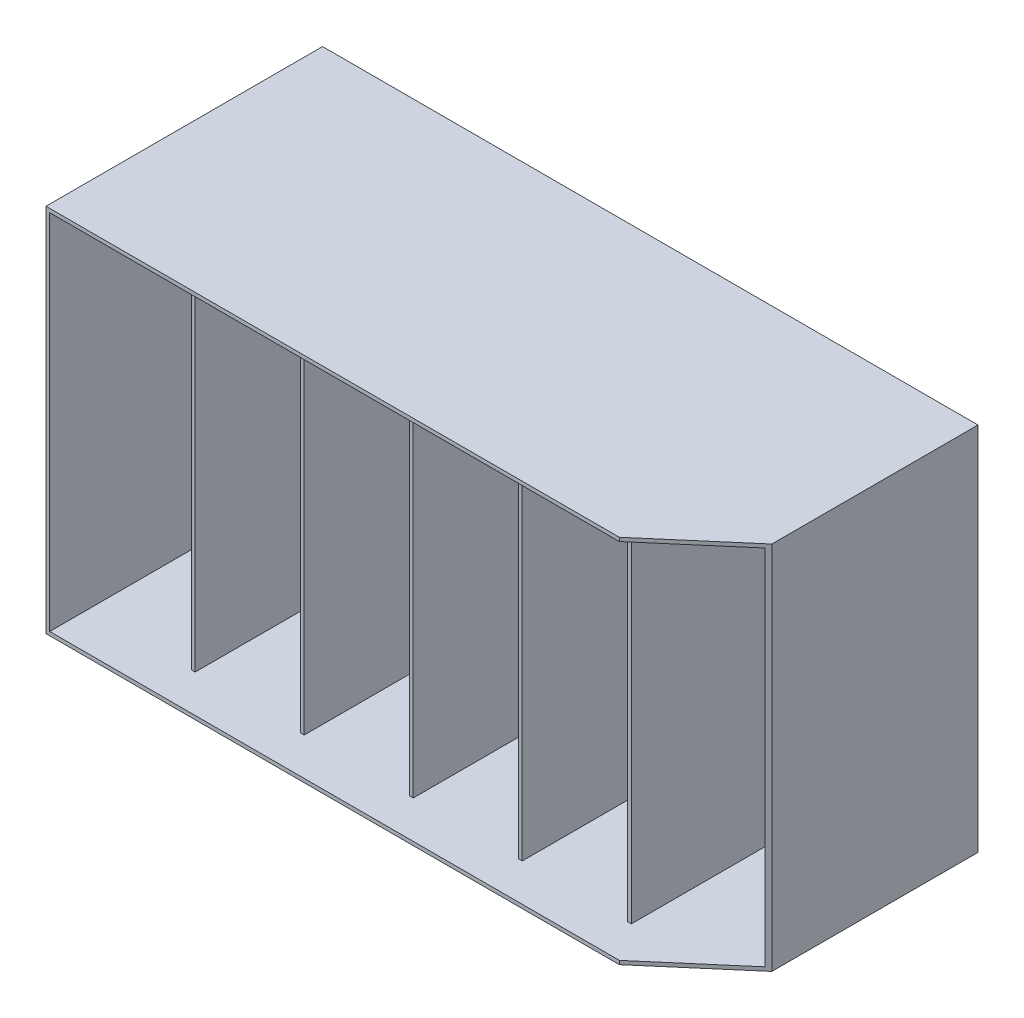
ISO-10303-21;
HEADER;
FILE_DESCRIPTION(('STEP AP214'),'2;1');
FILE_NAME('part.step','',(''),(''),'','','');
FILE_SCHEMA(('AUTOMOTIVE_DESIGN { 1 0 10303 214 1 1 1 1 }'));
ENDSEC;
DATA;
#1=APPLICATION_CONTEXT('core data for automotive mechanical design processes');
#2=APPLICATION_PROTOCOL_DEFINITION('international standard','automotive_design',2000,#1);
#3=PRODUCT_CONTEXT('',#1,'mechanical');
#4=PRODUCT('Part','Part','',(#3));
#5=PRODUCT_RELATED_PRODUCT_CATEGORY('part','',(#4));
#6=PRODUCT_DEFINITION_FORMATION('','',#4);
#7=PRODUCT_DEFINITION_CONTEXT('part definition',#1,'design');
#8=PRODUCT_DEFINITION('design','',#6,#7);
#9=PRODUCT_DEFINITION_SHAPE('','',#8);
#10=(LENGTH_UNIT() NAMED_UNIT(*) SI_UNIT(.MILLI.,.METRE.));
#11=(NAMED_UNIT(*) PLANE_ANGLE_UNIT() SI_UNIT($,.RADIAN.));
#12=(NAMED_UNIT(*) SI_UNIT($,.STERADIAN.) SOLID_ANGLE_UNIT());
#13=UNCERTAINTY_MEASURE_WITH_UNIT(LENGTH_MEASURE(1.E-05),#10,'distance_accuracy_value','');
#14=(GEOMETRIC_REPRESENTATION_CONTEXT(3) GLOBAL_UNCERTAINTY_ASSIGNED_CONTEXT((#13)) GLOBAL_UNIT_ASSIGNED_CONTEXT((#10,
#11,#12)) REPRESENTATION_CONTEXT('',''));
#15=CARTESIAN_POINT('',(0.,0.,0.));
#16=DIRECTION('',(0.,0.,1.));
#17=DIRECTION('',(1.,0.,0.));
#18=AXIS2_PLACEMENT_3D('',#15,#16,#17);
#19=CARTESIAN_POINT('',(0.,157.7875,3.175));
#20=DIRECTION('',(0.,1.,0.));
#21=DIRECTION('',(0.,0.,1.));
#22=AXIS2_PLACEMENT_3D('',#19,#20,#21);
#23=PLANE('',#22);
#24=DIRECTION('',(0.759256602365297,0.,-0.650791373455968));
#25=VECTOR('',#24,1.);
#26=CARTESIAN_POINT('',(205.187647058823,157.7875,239.385588235294));
#27=LINE('',#26,#25);
#28=CARTESIAN_POINT('',(209.4,157.7875,235.775));
#29=VERTEX_POINT('',#28);
#30=CARTESIAN_POINT('',(279.4,157.7875,175.775));
#31=VERTEX_POINT('',#30);
#32=EDGE_CURVE('E233',#29,#31,#27,.T.);
#33=ORIENTED_EDGE('',*,*,#32,.T.);
#34=DIRECTION('',(0.,0.,-1.));
#35=VECTOR('',#34,1.);
#36=CARTESIAN_POINT('',(279.4,157.7875,3.175));
#37=LINE('',#36,#35);
#38=CARTESIAN_POINT('',(279.4,157.7875,0.));
#39=VERTEX_POINT('',#38);
#40=EDGE_CURVE('E419',#31,#39,#37,.T.);
#41=ORIENTED_EDGE('',*,*,#40,.T.);
#42=DIRECTION('',(1.,0.,0.));
#43=VECTOR('',#42,1.);
#44=CARTESIAN_POINT('',(0.,157.7875,0.));
#45=LINE('',#44,#43);
#46=CARTESIAN_POINT('',(-279.4,157.7875,0.));
#47=VERTEX_POINT('',#46);
#48=EDGE_CURVE('E362',#47,#39,#45,.T.);
#49=ORIENTED_EDGE('',*,*,#48,.F.);
#50=DIRECTION('',(0.,0.,-1.));
#51=VECTOR('',#50,1.);
#52=CARTESIAN_POINT('',(-279.4,157.7875,3.175));
#53=LINE('',#52,#51);
#54=CARTESIAN_POINT('',(-279.4,157.7875,235.775));
#55=VERTEX_POINT('',#54);
#56=EDGE_CURVE('E256',#55,#47,#53,.T.);
#57=ORIENTED_EDGE('',*,*,#56,.F.);
#58=DIRECTION('',(-1.,0.,0.));
#59=VECTOR('',#58,1.);
#60=CARTESIAN_POINT('',(0.,157.7875,235.775));
#61=LINE('',#60,#59);
#62=EDGE_CURVE('E249',#29,#55,#61,.T.);
#63=ORIENTED_EDGE('',*,*,#62,.F.);
#64=EDGE_LOOP('',(#33,#41,#49,#57,#63));
#65=FACE_BOUND('',#64,.T.);
#66=ADVANCED_FACE('F39',(#65),#23,.T.);
#67=CARTESIAN_POINT('',(-279.4,0.,3.175));
#68=DIRECTION('',(1.,0.,0.));
#69=DIRECTION('',(0.,1.,0.));
#70=AXIS2_PLACEMENT_3D('',#67,#68,#69);
#71=PLANE('',#70);
#72=DIRECTION('',(0.,-1.,0.));
#73=VECTOR('',#72,1.);
#74=CARTESIAN_POINT('',(-279.4,0.,0.));
#75=LINE('',#74,#73);
#76=CARTESIAN_POINT('',(-279.4,-157.7875,0.));
#77=VERTEX_POINT('',#76);
#78=EDGE_CURVE('E411',#47,#77,#75,.T.);
#79=ORIENTED_EDGE('',*,*,#78,.T.);
#80=DIRECTION('',(0.,0.,-1.));
#81=VECTOR('',#80,1.);
#82=CARTESIAN_POINT('',(-279.4,-157.7875,3.175));
#83=LINE('',#82,#81);
#84=CARTESIAN_POINT('',(-279.4,-157.7875,235.775));
#85=VERTEX_POINT('',#84);
#86=EDGE_CURVE('E423',#85,#77,#83,.T.);
#87=ORIENTED_EDGE('',*,*,#86,.F.);
#88=DIRECTION('',(0.,-1.,0.));
#89=VECTOR('',#88,1.);
#90=CARTESIAN_POINT('',(-279.4,0.,235.775));
#91=LINE('',#90,#89);
#92=EDGE_CURVE('E258',#55,#85,#91,.T.);
#93=ORIENTED_EDGE('',*,*,#92,.F.);
#94=ORIENTED_EDGE('',*,*,#56,.T.);
#95=EDGE_LOOP('',(#79,#87,#93,#94));
#96=FACE_BOUND('',#95,.T.);
#97=ADVANCED_FACE('F536',(#96),#71,.F.);
#98=CARTESIAN_POINT('',(0.,-157.7875,3.175));
#99=DIRECTION('',(0.,1.,0.));
#100=DIRECTION('',(-1.,0.,0.));
#101=AXIS2_PLACEMENT_3D('',#98,#99,#100);
#102=PLANE('',#101);
#103=DIRECTION('',(0.,0.,-1.));
#104=VECTOR('',#103,1.);
#105=CARTESIAN_POINT('',(279.4,-157.7875,3.175));
#106=LINE('',#105,#104);
#107=CARTESIAN_POINT('',(279.4,-157.7875,175.775));
#108=VERTEX_POINT('',#107);
#109=CARTESIAN_POINT('',(279.4,-157.7875,0.));
#110=VERTEX_POINT('',#109);
#111=EDGE_CURVE('E421',#108,#110,#106,.T.);
#112=ORIENTED_EDGE('',*,*,#111,.F.);
#113=DIRECTION('',(0.759256602365297,0.,-0.650791373455968));
#114=VECTOR('',#113,1.);
#115=CARTESIAN_POINT('',(205.187647058823,-157.7875,239.385588235294));
#116=LINE('',#115,#114);
#117=CARTESIAN_POINT('',(209.4,-157.7875,235.775));
#118=VERTEX_POINT('',#117);
#119=EDGE_CURVE('E243',#118,#108,#116,.T.);
#120=ORIENTED_EDGE('',*,*,#119,.F.);
#121=DIRECTION('',(1.,0.,0.));
#122=VECTOR('',#121,1.);
#123=CARTESIAN_POINT('',(0.,-157.7875,235.775));
#124=LINE('',#123,#122);
#125=EDGE_CURVE('E259',#85,#118,#124,.T.);
#126=ORIENTED_EDGE('',*,*,#125,.F.);
#127=ORIENTED_EDGE('',*,*,#86,.T.);
#128=DIRECTION('',(1.,0.,0.));
#129=VECTOR('',#128,1.);
#130=CARTESIAN_POINT('',(0.,-157.7875,0.));
#131=LINE('',#130,#129);
#132=EDGE_CURVE('E413',#77,#110,#131,.T.);
#133=ORIENTED_EDGE('',*,*,#132,.T.);
#134=EDGE_LOOP('',(#112,#120,#126,#127,#133));
#135=FACE_BOUND('',#134,.T.);
#136=ADVANCED_FACE('F540',(#135),#102,.F.);
#137=CARTESIAN_POINT('',(279.4,0.,3.175));
#138=DIRECTION('',(1.,0.,0.));
#139=DIRECTION('',(0.,0.,-1.));
#140=AXIS2_PLACEMENT_3D('',#137,#138,#139);
#141=PLANE('',#140);
#142=DIRECTION('',(0.,-1.,0.));
#143=VECTOR('',#142,1.);
#144=CARTESIAN_POINT('',(279.4,157.7875,175.775));
#145=LINE('',#144,#143);
#146=EDGE_CURVE('E238',#31,#108,#145,.T.);
#147=ORIENTED_EDGE('',*,*,#146,.T.);
#148=ORIENTED_EDGE('',*,*,#111,.T.);
#149=DIRECTION('',(0.,-1.,0.));
#150=VECTOR('',#149,1.);
#151=CARTESIAN_POINT('',(279.4,0.,0.));
#152=LINE('',#151,#150);
#153=EDGE_CURVE('E416',#39,#110,#152,.T.);
#154=ORIENTED_EDGE('',*,*,#153,.F.);
#155=ORIENTED_EDGE('',*,*,#40,.F.);
#156=EDGE_LOOP('',(#147,#148,#154,#155));
#157=FACE_BOUND('',#156,.T.);
#158=ADVANCED_FACE('F544',(#157),#141,.T.);
#159=CARTESIAN_POINT('',(0.,0.,0.));
#160=DIRECTION('',(0.,0.,1.));
#161=DIRECTION('',(1.,0.,0.));
#162=AXIS2_PLACEMENT_3D('',#159,#160,#161);
#163=PLANE('',#162);
#164=ORIENTED_EDGE('',*,*,#48,.T.);
#165=ORIENTED_EDGE('',*,*,#153,.T.);
#166=ORIENTED_EDGE('',*,*,#132,.F.);
#167=ORIENTED_EDGE('',*,*,#78,.F.);
#168=EDGE_LOOP('',(#164,#165,#166,#167));
#169=FACE_BOUND('',#168,.T.);
#170=ADVANCED_FACE('F550',(#169),#163,.F.);
#171=CARTESIAN_POINT('',(0.,0.,235.775));
#172=DIRECTION('',(0.,0.,1.));
#173=DIRECTION('',(1.,0.,0.));
#174=AXIS2_PLACEMENT_3D('',#171,#172,#173);
#175=PLANE('',#174);
#176=DIRECTION('',(0.,-1.,0.));
#177=VECTOR('',#176,1.);
#178=CARTESIAN_POINT('',(209.4,157.7875,235.775));
#179=LINE('',#178,#177);
#180=CARTESIAN_POINT('',(209.4,154.6125,235.775));
#181=VERTEX_POINT('',#180);
#182=EDGE_CURVE('E236',#29,#181,#179,.T.);
#183=ORIENTED_EDGE('',*,*,#182,.F.);
#184=ORIENTED_EDGE('',*,*,#62,.T.);
#185=ORIENTED_EDGE('',*,*,#92,.T.);
#186=ORIENTED_EDGE('',*,*,#125,.T.);
#187=CARTESIAN_POINT('',(209.4,-154.6125,235.775));
#188=VERTEX_POINT('',#187);
#189=EDGE_CURVE('E242',#188,#118,#179,.T.);
#190=ORIENTED_EDGE('',*,*,#189,.F.);
#191=DIRECTION('',(1.,0.,0.));
#192=VECTOR('',#191,1.);
#193=CARTESIAN_POINT('',(0.,-154.6125,235.775));
#194=LINE('',#193,#192);
#195=CARTESIAN_POINT('',(-276.225,-154.6125,235.775));
#196=VERTEX_POINT('',#195);
#197=EDGE_CURVE('E1071',#196,#188,#194,.T.);
#198=ORIENTED_EDGE('',*,*,#197,.F.);
#199=DIRECTION('',(0.,1.,0.));
#200=VECTOR('',#199,1.);
#201=CARTESIAN_POINT('',(-276.225,0.,235.775));
#202=LINE('',#201,#200);
#203=CARTESIAN_POINT('',(-276.225,154.6125,235.775));
#204=VERTEX_POINT('',#203);
#205=EDGE_CURVE('E465',#196,#204,#202,.T.);
#206=ORIENTED_EDGE('',*,*,#205,.T.);
#207=DIRECTION('',(1.,0.,0.));
#208=VECTOR('',#207,1.);
#209=CARTESIAN_POINT('',(0.,154.6125,235.775));
#210=LINE('',#209,#208);
#211=EDGE_CURVE('E253',#204,#181,#210,.T.);
#212=ORIENTED_EDGE('',*,*,#211,.T.);
#213=EDGE_LOOP('',(#183,#184,#185,#186,#190,#198,#206,#212));
#214=FACE_BOUND('',#213,.T.);
#215=ADVANCED_FACE('F247',(#214),#175,.T.);
#216=CARTESIAN_POINT('',(0.,0.,3.175));
#217=DIRECTION('',(0.,0.,1.));
#218=DIRECTION('',(1.,0.,0.));
#219=AXIS2_PLACEMENT_3D('',#216,#217,#218);
#220=PLANE('',#219);
#221=DIRECTION('',(-1.,0.,0.));
#222=VECTOR('',#221,1.);
#223=CARTESIAN_POINT('',(0.,154.6125,3.175));
#224=LINE('',#223,#222);
#225=CARTESIAN_POINT('',(-187.45,154.6125,3.175));
#226=VERTEX_POINT('',#225);
#227=CARTESIAN_POINT('',(-276.225,154.6125,3.175));
#228=VERTEX_POINT('',#227);
#229=EDGE_CURVE('E341',#226,#228,#224,.T.);
#230=ORIENTED_EDGE('',*,*,#229,.T.);
#231=DIRECTION('',(0.,-1.,0.));
#232=VECTOR('',#231,1.);
#233=CARTESIAN_POINT('',(-276.225,0.,3.175));
#234=LINE('',#233,#232);
#235=CARTESIAN_POINT('',(-276.225,-154.6125,3.175));
#236=VERTEX_POINT('',#235);
#237=EDGE_CURVE('E345',#228,#236,#234,.T.);
#238=ORIENTED_EDGE('',*,*,#237,.T.);
#239=DIRECTION('',(1.,0.,0.));
#240=VECTOR('',#239,1.);
#241=CARTESIAN_POINT('',(0.,-154.6125,3.175));
#242=LINE('',#241,#240);
#243=CARTESIAN_POINT('',(-187.45,-154.6125,3.175));
#244=VERTEX_POINT('',#243);
#245=EDGE_CURVE('E344',#236,#244,#242,.T.);
#246=ORIENTED_EDGE('',*,*,#245,.T.);
#247=DIRECTION('',(0.,1.,0.));
#248=VECTOR('',#247,1.);
#249=CARTESIAN_POINT('',(-187.45,0.,3.175));
#250=LINE('',#249,#248);
#251=EDGE_CURVE('E342',#244,#226,#250,.T.);
#252=ORIENTED_EDGE('',*,*,#251,.T.);
#253=EDGE_LOOP('',(#230,#238,#246,#252));
#254=FACE_BOUND('',#253,.T.);
#255=ADVANCED_FACE('F457',(#254),#220,.T.);
#256=CARTESIAN_POINT('',(0.,-154.6125,203.775));
#257=DIRECTION('',(0.,1.,0.));
#258=DIRECTION('',(-1.,0.,0.));
#259=AXIS2_PLACEMENT_3D('',#256,#257,#258);
#260=PLANE('',#259);
#261=DIRECTION('',(-0.759256602365297,0.,0.650791373455968));
#262=VECTOR('',#261,1.);
#263=CARTESIAN_POINT('',(104.498823529412,-154.6125,325.690294117647));
#264=LINE('',#263,#262);
#265=CARTESIAN_POINT('',(276.225,-154.6125,178.496428571429));
#266=VERTEX_POINT('',#265);
#267=EDGE_CURVE('E1072',#266,#188,#264,.T.);
#268=ORIENTED_EDGE('',*,*,#267,.F.);
#269=DIRECTION('',(0.,0.,-1.));
#270=VECTOR('',#269,1.);
#271=CARTESIAN_POINT('',(276.225,-154.6125,203.775));
#272=LINE('',#271,#270);
#273=CARTESIAN_POINT('',(276.225,-154.6125,3.175));
#274=VERTEX_POINT('',#273);
#275=EDGE_CURVE('E355',#266,#274,#272,.T.);
#276=ORIENTED_EDGE('',*,*,#275,.T.);
#277=CARTESIAN_POINT('',(187.581,-154.6125,3.175));
#278=VERTEX_POINT('',#277);
#279=EDGE_CURVE('E278',#278,#274,#242,.T.);
#280=ORIENTED_EDGE('',*,*,#279,.F.);
#281=DIRECTION('',(0.,0.,-1.));
#282=VECTOR('',#281,1.);
#283=CARTESIAN_POINT('',(187.581,-154.6125,203.775));
#284=LINE('',#283,#282);
#285=CARTESIAN_POINT('',(187.581,-154.6125,203.775));
#286=VERTEX_POINT('',#285);
#287=EDGE_CURVE('E352',#286,#278,#284,.T.);
#288=ORIENTED_EDGE('',*,*,#287,.F.);
#289=DIRECTION('',(1.,0.,0.));
#290=VECTOR('',#289,1.);
#291=CARTESIAN_POINT('',(0.,-154.6125,203.775));
#292=LINE('',#291,#290);
#293=CARTESIAN_POINT('',(184.406,-154.6125,203.775));
#294=VERTEX_POINT('',#293);
#295=EDGE_CURVE('E269',#294,#286,#292,.T.);
#296=ORIENTED_EDGE('',*,*,#295,.F.);
#297=DIRECTION('',(0.,0.,-1.));
#298=VECTOR('',#297,1.);
#299=CARTESIAN_POINT('',(184.406,-154.6125,203.775));
#300=LINE('',#299,#298);
#301=CARTESIAN_POINT('',(184.406,-154.6125,3.175));
#302=VERTEX_POINT('',#301);
#303=EDGE_CURVE('E406',#294,#302,#300,.T.);
#304=ORIENTED_EDGE('',*,*,#303,.T.);
#305=CARTESIAN_POINT('',(94.6170000000001,-154.6125,3.175));
#306=VERTEX_POINT('',#305);
#307=EDGE_CURVE('E312',#306,#302,#242,.T.);
#308=ORIENTED_EDGE('',*,*,#307,.F.);
#309=DIRECTION('',(0.,0.,-1.));
#310=VECTOR('',#309,1.);
#311=CARTESIAN_POINT('',(94.6170000000001,-154.6125,203.775));
#312=LINE('',#311,#310);
#313=CARTESIAN_POINT('',(94.6170000000001,-154.6125,203.775));
#314=VERTEX_POINT('',#313);
#315=EDGE_CURVE('E403',#314,#306,#312,.T.);
#316=ORIENTED_EDGE('',*,*,#315,.F.);
#317=CARTESIAN_POINT('',(91.4420000000001,-154.6125,203.775));
#318=VERTEX_POINT('',#317);
#319=EDGE_CURVE('E490',#318,#314,#292,.T.);
#320=ORIENTED_EDGE('',*,*,#319,.F.);
#321=DIRECTION('',(0.,0.,-1.));
#322=VECTOR('',#321,1.);
#323=CARTESIAN_POINT('',(91.4420000000001,-154.6125,203.775));
#324=LINE('',#323,#322);
#325=CARTESIAN_POINT('',(91.4420000000001,-154.6125,3.175));
#326=VERTEX_POINT('',#325);
#327=EDGE_CURVE('E399',#318,#326,#324,.T.);
#328=ORIENTED_EDGE('',*,*,#327,.T.);
#329=CARTESIAN_POINT('',(1.65300000000007,-154.6125,3.175));
#330=VERTEX_POINT('',#329);
#331=EDGE_CURVE('E316',#330,#326,#242,.T.);
#332=ORIENTED_EDGE('',*,*,#331,.F.);
#333=DIRECTION('',(0.,0.,-1.));
#334=VECTOR('',#333,1.);
#335=CARTESIAN_POINT('',(1.65300000000007,-154.6125,203.775));
#336=LINE('',#335,#334);
#337=CARTESIAN_POINT('',(1.65300000000007,-154.6125,203.775));
#338=VERTEX_POINT('',#337);
#339=EDGE_CURVE('E395',#338,#330,#336,.T.);
#340=ORIENTED_EDGE('',*,*,#339,.F.);
#341=CARTESIAN_POINT('',(-1.52199999999994,-154.6125,203.775));
#342=VERTEX_POINT('',#341);
#343=EDGE_CURVE('E507',#342,#338,#292,.T.);
#344=ORIENTED_EDGE('',*,*,#343,.F.);
#345=DIRECTION('',(0.,0.,-1.));
#346=VECTOR('',#345,1.);
#347=CARTESIAN_POINT('',(-1.52199999999994,-154.6125,203.775));
#348=LINE('',#347,#346);
#349=CARTESIAN_POINT('',(-1.52199999999994,-154.6125,3.175));
#350=VERTEX_POINT('',#349);
#351=EDGE_CURVE('E390',#342,#350,#348,.T.);
#352=ORIENTED_EDGE('',*,*,#351,.T.);
#353=CARTESIAN_POINT('',(-91.311,-154.6125,3.175));
#354=VERTEX_POINT('',#353);
#355=EDGE_CURVE('E329',#354,#350,#242,.T.);
#356=ORIENTED_EDGE('',*,*,#355,.F.);
#357=DIRECTION('',(0.,0.,-1.));
#358=VECTOR('',#357,1.);
#359=CARTESIAN_POINT('',(-91.311,-154.6125,203.775));
#360=LINE('',#359,#358);
#361=CARTESIAN_POINT('',(-91.311,-154.6125,203.775));
#362=VERTEX_POINT('',#361);
#363=EDGE_CURVE('E386',#362,#354,#360,.T.);
#364=ORIENTED_EDGE('',*,*,#363,.F.);
#365=CARTESIAN_POINT('',(-94.486,-154.6125,203.775));
#366=VERTEX_POINT('',#365);
#367=EDGE_CURVE('E268',#366,#362,#292,.T.);
#368=ORIENTED_EDGE('',*,*,#367,.F.);
#369=DIRECTION('',(0.,0.,-1.));
#370=VECTOR('',#369,1.);
#371=CARTESIAN_POINT('',(-94.486,-154.6125,203.775));
#372=LINE('',#371,#370);
#373=CARTESIAN_POINT('',(-94.486,-154.6125,3.175));
#374=VERTEX_POINT('',#373);
#375=EDGE_CURVE('E381',#366,#374,#372,.T.);
#376=ORIENTED_EDGE('',*,*,#375,.T.);
#377=CARTESIAN_POINT('',(-184.275,-154.6125,3.175));
#378=VERTEX_POINT('',#377);
#379=EDGE_CURVE('E337',#378,#374,#242,.T.);
#380=ORIENTED_EDGE('',*,*,#379,.F.);
#381=DIRECTION('',(0.,0.,-1.));
#382=VECTOR('',#381,1.);
#383=CARTESIAN_POINT('',(-184.275,-154.6125,203.775));
#384=LINE('',#383,#382);
#385=CARTESIAN_POINT('',(-184.275,-154.6125,203.775));
#386=VERTEX_POINT('',#385);
#387=EDGE_CURVE('E377',#386,#378,#384,.T.);
#388=ORIENTED_EDGE('',*,*,#387,.F.);
#389=CARTESIAN_POINT('',(-187.45,-154.6125,203.775));
#390=VERTEX_POINT('',#389);
#391=EDGE_CURVE('E46',#390,#386,#292,.T.);
#392=ORIENTED_EDGE('',*,*,#391,.F.);
#393=DIRECTION('',(0.,0.,-1.));
#394=VECTOR('',#393,1.);
#395=CARTESIAN_POINT('',(-187.45,-154.6125,203.775));
#396=LINE('',#395,#394);
#397=EDGE_CURVE('E370',#390,#244,#396,.T.);
#398=ORIENTED_EDGE('',*,*,#397,.T.);
#399=ORIENTED_EDGE('',*,*,#245,.F.);
#400=DIRECTION('',(0.,0.,-1.));
#401=VECTOR('',#400,1.);
#402=CARTESIAN_POINT('',(-276.225,-154.6125,203.775));
#403=LINE('',#402,#401);
#404=EDGE_CURVE('E366',#196,#236,#403,.T.);
#405=ORIENTED_EDGE('',*,*,#404,.F.);
#406=ORIENTED_EDGE('',*,*,#197,.T.);
#407=EDGE_LOOP('',(#268,#276,#280,#288,#296,#304,#308,#316,#320,#328,#332,#340,#344,#352,#356,
#364,#368,#376,#380,#388,#392,#398,#399,#405,#406));
#408=FACE_BOUND('',#407,.T.);
#409=ADVANCED_FACE('F470',(#408),#260,.T.);
#410=CARTESIAN_POINT('',(-276.225,0.,203.775));
#411=DIRECTION('',(1.,0.,0.));
#412=DIRECTION('',(0.,0.,-1.));
#413=AXIS2_PLACEMENT_3D('',#410,#411,#412);
#414=PLANE('',#413);
#415=ORIENTED_EDGE('',*,*,#237,.F.);
#416=DIRECTION('',(0.,0.,-1.));
#417=VECTOR('',#416,1.);
#418=CARTESIAN_POINT('',(-276.225,154.6125,203.775));
#419=LINE('',#418,#417);
#420=EDGE_CURVE('E363',#204,#228,#419,.T.);
#421=ORIENTED_EDGE('',*,*,#420,.F.);
#422=ORIENTED_EDGE('',*,*,#205,.F.);
#423=ORIENTED_EDGE('',*,*,#404,.T.);
#424=EDGE_LOOP('',(#415,#421,#422,#423));
#425=FACE_BOUND('',#424,.T.);
#426=ADVANCED_FACE('F463',(#425),#414,.T.);
#427=CARTESIAN_POINT('',(-187.45,0.,203.775));
#428=DIRECTION('',(-1.,0.,0.));
#429=DIRECTION('',(0.,0.,1.));
#430=AXIS2_PLACEMENT_3D('',#427,#428,#429);
#431=PLANE('',#430);
#432=ORIENTED_EDGE('',*,*,#251,.F.);
#433=ORIENTED_EDGE('',*,*,#397,.F.);
#434=DIRECTION('',(0.,1.,0.));
#435=VECTOR('',#434,1.);
#436=CARTESIAN_POINT('',(-187.45,0.,203.775));
#437=LINE('',#436,#435);
#438=CARTESIAN_POINT('',(-187.45,154.6125,203.775));
#439=VERTEX_POINT('',#438);
#440=EDGE_CURVE('E299',#390,#439,#437,.T.);
#441=ORIENTED_EDGE('',*,*,#440,.T.);
#442=DIRECTION('',(0.,0.,-1.));
#443=VECTOR('',#442,1.);
#444=CARTESIAN_POINT('',(-187.45,154.6125,203.775));
#445=LINE('',#444,#443);
#446=EDGE_CURVE('E356',#439,#226,#445,.T.);
#447=ORIENTED_EDGE('',*,*,#446,.T.);
#448=EDGE_LOOP('',(#432,#433,#441,#447));
#449=FACE_BOUND('',#448,.T.);
#450=ADVANCED_FACE('F658',(#449),#431,.T.);
#451=CARTESIAN_POINT('',(0.,0.,203.775));
#452=DIRECTION('',(0.,0.,1.));
#453=DIRECTION('',(1.,0.,0.));
#454=AXIS2_PLACEMENT_3D('',#451,#452,#453);
#455=PLANE('',#454);
#456=ORIENTED_EDGE('',*,*,#440,.F.);
#457=ORIENTED_EDGE('',*,*,#391,.T.);
#458=DIRECTION('',(0.,1.,0.));
#459=VECTOR('',#458,1.);
#460=CARTESIAN_POINT('',(-184.275,0.,203.775));
#461=LINE('',#460,#459);
#462=CARTESIAN_POINT('',(-184.275,154.6125,203.775));
#463=VERTEX_POINT('',#462);
#464=EDGE_CURVE('E296',#386,#463,#461,.T.);
#465=ORIENTED_EDGE('',*,*,#464,.T.);
#466=DIRECTION('',(1.,0.,0.));
#467=VECTOR('',#466,1.);
#468=CARTESIAN_POINT('',(0.,154.6125,203.775));
#469=LINE('',#468,#467);
#470=EDGE_CURVE('E270',#439,#463,#469,.T.);
#471=ORIENTED_EDGE('',*,*,#470,.F.);
#472=EDGE_LOOP('',(#456,#457,#465,#471));
#473=FACE_BOUND('',#472,.T.);
#474=ADVANCED_FACE('F578',(#473),#455,.T.);
#475=CARTESIAN_POINT('',(-184.275,0.,203.775));
#476=DIRECTION('',(-1.,0.,0.));
#477=DIRECTION('',(0.,0.,1.));
#478=AXIS2_PLACEMENT_3D('',#475,#476,#477);
#479=PLANE('',#478);
#480=DIRECTION('',(0.,1.,0.));
#481=VECTOR('',#480,1.);
#482=CARTESIAN_POINT('',(-184.275,0.,3.175));
#483=LINE('',#482,#481);
#484=CARTESIAN_POINT('',(-184.275,154.6125,3.175));
#485=VERTEX_POINT('',#484);
#486=EDGE_CURVE('E338',#378,#485,#483,.T.);
#487=ORIENTED_EDGE('',*,*,#486,.T.);
#488=DIRECTION('',(0.,0.,-1.));
#489=VECTOR('',#488,1.);
#490=CARTESIAN_POINT('',(-184.275,154.6125,203.775));
#491=LINE('',#490,#489);
#492=EDGE_CURVE('E375',#463,#485,#491,.T.);
#493=ORIENTED_EDGE('',*,*,#492,.F.);
#494=ORIENTED_EDGE('',*,*,#464,.F.);
#495=ORIENTED_EDGE('',*,*,#387,.T.);
#496=EDGE_LOOP('',(#487,#493,#494,#495));
#497=FACE_BOUND('',#496,.T.);
#498=ADVANCED_FACE('F684',(#497),#479,.F.);
#499=CARTESIAN_POINT('',(-94.486,154.6125,3.175));
#500=VERTEX_POINT('',#499);
#501=EDGE_CURVE('E333',#500,#485,#224,.T.);
#502=ORIENTED_EDGE('',*,*,#501,.T.);
#503=ORIENTED_EDGE('',*,*,#486,.F.);
#504=ORIENTED_EDGE('',*,*,#379,.T.);
#505=DIRECTION('',(0.,1.,0.));
#506=VECTOR('',#505,1.);
#507=CARTESIAN_POINT('',(-94.486,0.,3.175));
#508=LINE('',#507,#506);
#509=EDGE_CURVE('E334',#374,#500,#508,.T.);
#510=ORIENTED_EDGE('',*,*,#509,.T.);
#511=EDGE_LOOP('',(#502,#503,#504,#510));
#512=FACE_BOUND('',#511,.T.);
#513=ADVANCED_FACE('F694',(#512),#220,.T.);
#514=CARTESIAN_POINT('',(-94.486,0.,203.775));
#515=DIRECTION('',(-1.,0.,0.));
#516=DIRECTION('',(0.,0.,1.));
#517=AXIS2_PLACEMENT_3D('',#514,#515,#516);
#518=PLANE('',#517);
#519=ORIENTED_EDGE('',*,*,#509,.F.);
#520=ORIENTED_EDGE('',*,*,#375,.F.);
#521=DIRECTION('',(0.,1.,0.));
#522=VECTOR('',#521,1.);
#523=CARTESIAN_POINT('',(-94.486,0.,203.775));
#524=LINE('',#523,#522);
#525=CARTESIAN_POINT('',(-94.486,154.6125,203.775));
#526=VERTEX_POINT('',#525);
#527=EDGE_CURVE('E293',#366,#526,#524,.T.);
#528=ORIENTED_EDGE('',*,*,#527,.T.);
#529=DIRECTION('',(0.,0.,-1.));
#530=VECTOR('',#529,1.);
#531=CARTESIAN_POINT('',(-94.486,154.6125,203.775));
#532=LINE('',#531,#530);
#533=EDGE_CURVE('E367',#526,#500,#532,.T.);
#534=ORIENTED_EDGE('',*,*,#533,.T.);
#535=EDGE_LOOP('',(#519,#520,#528,#534));
#536=FACE_BOUND('',#535,.T.);
#537=ADVANCED_FACE('F703',(#536),#518,.T.);
#538=ORIENTED_EDGE('',*,*,#527,.F.);
#539=ORIENTED_EDGE('',*,*,#367,.T.);
#540=DIRECTION('',(0.,1.,0.));
#541=VECTOR('',#540,1.);
#542=CARTESIAN_POINT('',(-91.311,0.,203.775));
#543=LINE('',#542,#541);
#544=CARTESIAN_POINT('',(-91.311,154.6125,203.775));
#545=VERTEX_POINT('',#544);
#546=EDGE_CURVE('E290',#362,#545,#543,.T.);
#547=ORIENTED_EDGE('',*,*,#546,.T.);
#548=EDGE_CURVE('E272',#526,#545,#469,.T.);
#549=ORIENTED_EDGE('',*,*,#548,.F.);
#550=EDGE_LOOP('',(#538,#539,#547,#549));
#551=FACE_BOUND('',#550,.T.);
#552=ADVANCED_FACE('F441',(#551),#455,.T.);
#553=CARTESIAN_POINT('',(-91.311,0.,203.775));
#554=DIRECTION('',(-1.,0.,0.));
#555=DIRECTION('',(0.,0.,1.));
#556=AXIS2_PLACEMENT_3D('',#553,#554,#555);
#557=PLANE('',#556);
#558=DIRECTION('',(0.,1.,0.));
#559=VECTOR('',#558,1.);
#560=CARTESIAN_POINT('',(-91.311,0.,3.175));
#561=LINE('',#560,#559);
#562=CARTESIAN_POINT('',(-91.311,154.6125,3.175));
#563=VERTEX_POINT('',#562);
#564=EDGE_CURVE('E330',#354,#563,#561,.T.);
#565=ORIENTED_EDGE('',*,*,#564,.T.);
#566=DIRECTION('',(0.,0.,-1.));
#567=VECTOR('',#566,1.);
#568=CARTESIAN_POINT('',(-91.311,154.6125,203.775));
#569=LINE('',#568,#567);
#570=EDGE_CURVE('E384',#545,#563,#569,.T.);
#571=ORIENTED_EDGE('',*,*,#570,.F.);
#572=ORIENTED_EDGE('',*,*,#546,.F.);
#573=ORIENTED_EDGE('',*,*,#363,.T.);
#574=EDGE_LOOP('',(#565,#571,#572,#573));
#575=FACE_BOUND('',#574,.T.);
#576=ADVANCED_FACE('F444',(#575),#557,.F.);
#577=CARTESIAN_POINT('',(-1.52199999999994,154.6125,3.175));
#578=VERTEX_POINT('',#577);
#579=EDGE_CURVE('E325',#578,#563,#224,.T.);
#580=ORIENTED_EDGE('',*,*,#579,.T.);
#581=ORIENTED_EDGE('',*,*,#564,.F.);
#582=ORIENTED_EDGE('',*,*,#355,.T.);
#583=DIRECTION('',(0.,1.,0.));
#584=VECTOR('',#583,1.);
#585=CARTESIAN_POINT('',(-1.52199999999994,0.,3.175));
#586=LINE('',#585,#584);
#587=EDGE_CURVE('E326',#350,#578,#586,.T.);
#588=ORIENTED_EDGE('',*,*,#587,.T.);
#589=EDGE_LOOP('',(#580,#581,#582,#588));
#590=FACE_BOUND('',#589,.T.);
#591=ADVANCED_FACE('F449',(#590),#220,.T.);
#592=CARTESIAN_POINT('',(-1.52199999999994,0.,203.775));
#593=DIRECTION('',(-1.,0.,0.));
#594=DIRECTION('',(0.,0.,1.));
#595=AXIS2_PLACEMENT_3D('',#592,#593,#594);
#596=PLANE('',#595);
#597=ORIENTED_EDGE('',*,*,#587,.F.);
#598=ORIENTED_EDGE('',*,*,#351,.F.);
#599=DIRECTION('',(0.,1.,0.));
#600=VECTOR('',#599,1.);
#601=CARTESIAN_POINT('',(-1.52199999999994,0.,203.775));
#602=LINE('',#601,#600);
#603=CARTESIAN_POINT('',(-1.52199999999994,154.6125,203.775));
#604=VERTEX_POINT('',#603);
#605=EDGE_CURVE('E287',#342,#604,#602,.T.);
#606=ORIENTED_EDGE('',*,*,#605,.T.);
#607=DIRECTION('',(0.,0.,-1.));
#608=VECTOR('',#607,1.);
#609=CARTESIAN_POINT('',(-1.52199999999994,154.6125,203.775));
#610=LINE('',#609,#608);
#611=EDGE_CURVE('E378',#604,#578,#610,.T.);
#612=ORIENTED_EDGE('',*,*,#611,.T.);
#613=EDGE_LOOP('',(#597,#598,#606,#612));
#614=FACE_BOUND('',#613,.T.);
#615=ADVANCED_FACE('F732',(#614),#596,.T.);
#616=ORIENTED_EDGE('',*,*,#605,.F.);
#617=ORIENTED_EDGE('',*,*,#343,.T.);
#618=DIRECTION('',(0.,1.,0.));
#619=VECTOR('',#618,1.);
#620=CARTESIAN_POINT('',(1.65300000000007,0.,203.775));
#621=LINE('',#620,#619);
#622=CARTESIAN_POINT('',(1.65300000000007,154.6125,203.775));
#623=VERTEX_POINT('',#622);
#624=EDGE_CURVE('E284',#338,#623,#621,.T.);
#625=ORIENTED_EDGE('',*,*,#624,.T.);
#626=EDGE_CURVE('E430',#604,#623,#469,.T.);
#627=ORIENTED_EDGE('',*,*,#626,.F.);
#628=EDGE_LOOP('',(#616,#617,#625,#627));
#629=FACE_BOUND('',#628,.T.);
#630=ADVANCED_FACE('F511',(#629),#455,.T.);
#631=CARTESIAN_POINT('',(1.65300000000007,0.,203.775));
#632=DIRECTION('',(-1.,0.,0.));
#633=DIRECTION('',(0.,0.,1.));
#634=AXIS2_PLACEMENT_3D('',#631,#632,#633);
#635=PLANE('',#634);
#636=DIRECTION('',(0.,1.,0.));
#637=VECTOR('',#636,1.);
#638=CARTESIAN_POINT('',(1.65300000000007,0.,3.175));
#639=LINE('',#638,#637);
#640=CARTESIAN_POINT('',(1.65300000000007,154.6125,3.175));
#641=VERTEX_POINT('',#640);
#642=EDGE_CURVE('E322',#330,#641,#639,.T.);
#643=ORIENTED_EDGE('',*,*,#642,.T.);
#644=DIRECTION('',(0.,0.,-1.));
#645=VECTOR('',#644,1.);
#646=CARTESIAN_POINT('',(1.65300000000007,154.6125,203.775));
#647=LINE('',#646,#645);
#648=EDGE_CURVE('E393',#623,#641,#647,.T.);
#649=ORIENTED_EDGE('',*,*,#648,.F.);
#650=ORIENTED_EDGE('',*,*,#624,.F.);
#651=ORIENTED_EDGE('',*,*,#339,.T.);
#652=EDGE_LOOP('',(#643,#649,#650,#651));
#653=FACE_BOUND('',#652,.T.);
#654=ADVANCED_FACE('F518',(#653),#635,.F.);
#655=CARTESIAN_POINT('',(91.4420000000001,154.6125,3.175));
#656=VERTEX_POINT('',#655);
#657=EDGE_CURVE('E309',#656,#641,#224,.T.);
#658=ORIENTED_EDGE('',*,*,#657,.T.);
#659=ORIENTED_EDGE('',*,*,#642,.F.);
#660=ORIENTED_EDGE('',*,*,#331,.T.);
#661=DIRECTION('',(0.,1.,0.));
#662=VECTOR('',#661,1.);
#663=CARTESIAN_POINT('',(91.4420000000001,0.,3.175));
#664=LINE('',#663,#662);
#665=EDGE_CURVE('E319',#326,#656,#664,.T.);
#666=ORIENTED_EDGE('',*,*,#665,.T.);
#667=EDGE_LOOP('',(#658,#659,#660,#666));
#668=FACE_BOUND('',#667,.T.);
#669=ADVANCED_FACE('F522',(#668),#220,.T.);
#670=CARTESIAN_POINT('',(91.4420000000001,0.,203.775));
#671=DIRECTION('',(-1.,0.,0.));
#672=DIRECTION('',(0.,0.,1.));
#673=AXIS2_PLACEMENT_3D('',#670,#671,#672);
#674=PLANE('',#673);
#675=ORIENTED_EDGE('',*,*,#665,.F.);
#676=ORIENTED_EDGE('',*,*,#327,.F.);
#677=DIRECTION('',(0.,1.,0.));
#678=VECTOR('',#677,1.);
#679=CARTESIAN_POINT('',(91.4420000000001,0.,203.775));
#680=LINE('',#679,#678);
#681=CARTESIAN_POINT('',(91.4420000000001,154.6125,203.775));
#682=VERTEX_POINT('',#681);
#683=EDGE_CURVE('E281',#318,#682,#680,.T.);
#684=ORIENTED_EDGE('',*,*,#683,.T.);
#685=DIRECTION('',(0.,0.,-1.));
#686=VECTOR('',#685,1.);
#687=CARTESIAN_POINT('',(91.4420000000001,154.6125,203.775));
#688=LINE('',#687,#686);
#689=EDGE_CURVE('E387',#682,#656,#688,.T.);
#690=ORIENTED_EDGE('',*,*,#689,.T.);
#691=EDGE_LOOP('',(#675,#676,#684,#690));
#692=FACE_BOUND('',#691,.T.);
#693=ADVANCED_FACE('F524',(#692),#674,.T.);
#694=ORIENTED_EDGE('',*,*,#683,.F.);
#695=ORIENTED_EDGE('',*,*,#319,.T.);
#696=DIRECTION('',(0.,1.,0.));
#697=VECTOR('',#696,1.);
#698=CARTESIAN_POINT('',(94.6170000000001,0.,203.775));
#699=LINE('',#698,#697);
#700=CARTESIAN_POINT('',(94.6170000000001,154.6125,203.775));
#701=VERTEX_POINT('',#700);
#702=EDGE_CURVE('E277',#314,#701,#699,.T.);
#703=ORIENTED_EDGE('',*,*,#702,.T.);
#704=EDGE_CURVE('E427',#682,#701,#469,.T.);
#705=ORIENTED_EDGE('',*,*,#704,.F.);
#706=EDGE_LOOP('',(#694,#695,#703,#705));
#707=FACE_BOUND('',#706,.T.);
#708=ADVANCED_FACE('F505',(#707),#455,.T.);
#709=CARTESIAN_POINT('',(94.6170000000001,0.,203.775));
#710=DIRECTION('',(-1.,0.,0.));
#711=DIRECTION('',(0.,0.,1.));
#712=AXIS2_PLACEMENT_3D('',#709,#710,#711);
#713=PLANE('',#712);
#714=DIRECTION('',(0.,1.,0.));
#715=VECTOR('',#714,1.);
#716=CARTESIAN_POINT('',(94.6170000000001,0.,3.175));
#717=LINE('',#716,#715);
#718=CARTESIAN_POINT('',(94.6170000000001,154.6125,3.175));
#719=VERTEX_POINT('',#718);
#720=EDGE_CURVE('E315',#306,#719,#717,.T.);
#721=ORIENTED_EDGE('',*,*,#720,.T.);
#722=DIRECTION('',(0.,0.,-1.));
#723=VECTOR('',#722,1.);
#724=CARTESIAN_POINT('',(94.6170000000001,154.6125,203.775));
#725=LINE('',#724,#723);
#726=EDGE_CURVE('E305',#701,#719,#725,.T.);
#727=ORIENTED_EDGE('',*,*,#726,.F.);
#728=ORIENTED_EDGE('',*,*,#702,.F.);
#729=ORIENTED_EDGE('',*,*,#315,.T.);
#730=EDGE_LOOP('',(#721,#727,#728,#729));
#731=FACE_BOUND('',#730,.T.);
#732=ADVANCED_FACE('F502',(#731),#713,.F.);
#733=CARTESIAN_POINT('',(184.406,154.6125,3.175));
#734=VERTEX_POINT('',#733);
#735=EDGE_CURVE('E261',#734,#719,#224,.T.);
#736=ORIENTED_EDGE('',*,*,#735,.T.);
#737=ORIENTED_EDGE('',*,*,#720,.F.);
#738=ORIENTED_EDGE('',*,*,#307,.T.);
#739=DIRECTION('',(0.,1.,0.));
#740=VECTOR('',#739,1.);
#741=CARTESIAN_POINT('',(184.406,0.,3.175));
#742=LINE('',#741,#740);
#743=EDGE_CURVE('E308',#302,#734,#742,.T.);
#744=ORIENTED_EDGE('',*,*,#743,.T.);
#745=EDGE_LOOP('',(#736,#737,#738,#744));
#746=FACE_BOUND('',#745,.T.);
#747=ADVANCED_FACE('F498',(#746),#220,.T.);
#748=CARTESIAN_POINT('',(184.406,0.,203.775));
#749=DIRECTION('',(-1.,0.,0.));
#750=DIRECTION('',(0.,0.,1.));
#751=AXIS2_PLACEMENT_3D('',#748,#749,#750);
#752=PLANE('',#751);
#753=ORIENTED_EDGE('',*,*,#743,.F.);
#754=ORIENTED_EDGE('',*,*,#303,.F.);
#755=DIRECTION('',(0.,1.,0.));
#756=VECTOR('',#755,1.);
#757=CARTESIAN_POINT('',(184.406,0.,203.775));
#758=LINE('',#757,#756);
#759=CARTESIAN_POINT('',(184.406,154.6125,203.775));
#760=VERTEX_POINT('',#759);
#761=EDGE_CURVE('E274',#294,#760,#758,.T.);
#762=ORIENTED_EDGE('',*,*,#761,.T.);
#763=DIRECTION('',(0.,0.,-1.));
#764=VECTOR('',#763,1.);
#765=CARTESIAN_POINT('',(184.406,154.6125,203.775));
#766=LINE('',#765,#764);
#767=EDGE_CURVE('E396',#760,#734,#766,.T.);
#768=ORIENTED_EDGE('',*,*,#767,.T.);
#769=EDGE_LOOP('',(#753,#754,#762,#768));
#770=FACE_BOUND('',#769,.T.);
#771=ADVANCED_FACE('F492',(#770),#752,.T.);
#772=ORIENTED_EDGE('',*,*,#761,.F.);
#773=ORIENTED_EDGE('',*,*,#295,.T.);
#774=DIRECTION('',(0.,1.,0.));
#775=VECTOR('',#774,1.);
#776=CARTESIAN_POINT('',(187.581,0.,203.775));
#777=LINE('',#776,#775);
#778=CARTESIAN_POINT('',(187.581,154.6125,203.775));
#779=VERTEX_POINT('',#778);
#780=EDGE_CURVE('E302',#286,#779,#777,.T.);
#781=ORIENTED_EDGE('',*,*,#780,.T.);
#782=EDGE_CURVE('E273',#760,#779,#469,.T.);
#783=ORIENTED_EDGE('',*,*,#782,.F.);
#784=EDGE_LOOP('',(#772,#773,#781,#783));
#785=FACE_BOUND('',#784,.T.);
#786=ADVANCED_FACE('F493',(#785),#455,.T.);
#787=CARTESIAN_POINT('',(187.581,0.,203.775));
#788=DIRECTION('',(-1.,0.,0.));
#789=DIRECTION('',(0.,0.,1.));
#790=AXIS2_PLACEMENT_3D('',#787,#788,#789);
#791=PLANE('',#790);
#792=DIRECTION('',(0.,1.,0.));
#793=VECTOR('',#792,1.);
#794=CARTESIAN_POINT('',(187.581,0.,3.175));
#795=LINE('',#794,#793);
#796=CARTESIAN_POINT('',(187.581,154.6125,3.175));
#797=VERTEX_POINT('',#796);
#798=EDGE_CURVE('E347',#278,#797,#795,.T.);
#799=ORIENTED_EDGE('',*,*,#798,.T.);
#800=DIRECTION('',(0.,0.,-1.));
#801=VECTOR('',#800,1.);
#802=CARTESIAN_POINT('',(187.581,154.6125,203.775));
#803=LINE('',#802,#801);
#804=EDGE_CURVE('E360',#779,#797,#803,.T.);
#805=ORIENTED_EDGE('',*,*,#804,.F.);
#806=ORIENTED_EDGE('',*,*,#780,.F.);
#807=ORIENTED_EDGE('',*,*,#287,.T.);
#808=EDGE_LOOP('',(#799,#805,#806,#807));
#809=FACE_BOUND('',#808,.T.);
#810=ADVANCED_FACE('F485',(#809),#791,.F.);
#811=CARTESIAN_POINT('',(276.225,154.6125,3.175));
#812=VERTEX_POINT('',#811);
#813=EDGE_CURVE('E60',#812,#797,#224,.T.);
#814=ORIENTED_EDGE('',*,*,#813,.T.);
#815=ORIENTED_EDGE('',*,*,#798,.F.);
#816=ORIENTED_EDGE('',*,*,#279,.T.);
#817=DIRECTION('',(0.,1.,0.));
#818=VECTOR('',#817,1.);
#819=CARTESIAN_POINT('',(276.225,0.,3.175));
#820=LINE('',#819,#818);
#821=EDGE_CURVE('E350',#274,#812,#820,.T.);
#822=ORIENTED_EDGE('',*,*,#821,.T.);
#823=EDGE_LOOP('',(#814,#815,#816,#822));
#824=FACE_BOUND('',#823,.T.);
#825=ADVANCED_FACE('F476',(#824),#220,.T.);
#826=CARTESIAN_POINT('',(0.,154.6125,203.775));
#827=DIRECTION('',(0.,-1.,0.));
#828=DIRECTION('',(1.,0.,0.));
#829=AXIS2_PLACEMENT_3D('',#826,#827,#828);
#830=PLANE('',#829);
#831=DIRECTION('',(0.759256602365297,0.,-0.650791373455968));
#832=VECTOR('',#831,1.);
#833=CARTESIAN_POINT('',(104.498823529412,154.6125,325.690294117647));
#834=LINE('',#833,#832);
#835=CARTESIAN_POINT('',(276.225,154.6125,178.496428571429));
#836=VERTEX_POINT('',#835);
#837=EDGE_CURVE('E52',#181,#836,#834,.T.);
#838=ORIENTED_EDGE('',*,*,#837,.F.);
#839=ORIENTED_EDGE('',*,*,#211,.F.);
#840=ORIENTED_EDGE('',*,*,#420,.T.);
#841=ORIENTED_EDGE('',*,*,#229,.F.);
#842=ORIENTED_EDGE('',*,*,#446,.F.);
#843=ORIENTED_EDGE('',*,*,#470,.T.);
#844=ORIENTED_EDGE('',*,*,#492,.T.);
#845=ORIENTED_EDGE('',*,*,#501,.F.);
#846=ORIENTED_EDGE('',*,*,#533,.F.);
#847=ORIENTED_EDGE('',*,*,#548,.T.);
#848=ORIENTED_EDGE('',*,*,#570,.T.);
#849=ORIENTED_EDGE('',*,*,#579,.F.);
#850=ORIENTED_EDGE('',*,*,#611,.F.);
#851=ORIENTED_EDGE('',*,*,#626,.T.);
#852=ORIENTED_EDGE('',*,*,#648,.T.);
#853=ORIENTED_EDGE('',*,*,#657,.F.);
#854=ORIENTED_EDGE('',*,*,#689,.F.);
#855=ORIENTED_EDGE('',*,*,#704,.T.);
#856=ORIENTED_EDGE('',*,*,#726,.T.);
#857=ORIENTED_EDGE('',*,*,#735,.F.);
#858=ORIENTED_EDGE('',*,*,#767,.F.);
#859=ORIENTED_EDGE('',*,*,#782,.T.);
#860=ORIENTED_EDGE('',*,*,#804,.T.);
#861=ORIENTED_EDGE('',*,*,#813,.F.);
#862=DIRECTION('',(0.,0.,-1.));
#863=VECTOR('',#862,1.);
#864=CARTESIAN_POINT('',(276.225,154.6125,203.775));
#865=LINE('',#864,#863);
#866=EDGE_CURVE('E358',#836,#812,#865,.T.);
#867=ORIENTED_EDGE('',*,*,#866,.F.);
#868=EDGE_LOOP('',(#838,#839,#840,#841,#842,#843,#844,#845,#846,#847,#848,#849,#850,#851,#852,
#853,#854,#855,#856,#857,#858,#859,#860,#861,#867));
#869=FACE_BOUND('',#868,.T.);
#870=ADVANCED_FACE('F434',(#869),#830,.T.);
#871=CARTESIAN_POINT('',(276.225,0.,203.775));
#872=DIRECTION('',(-1.,0.,0.));
#873=DIRECTION('',(0.,0.,1.));
#874=AXIS2_PLACEMENT_3D('',#871,#872,#873);
#875=PLANE('',#874);
#876=DIRECTION('',(0.,-1.,0.));
#877=VECTOR('',#876,1.);
#878=CARTESIAN_POINT('',(276.225,0.,178.496428571429));
#879=LINE('',#878,#877);
#880=EDGE_CURVE('E11',#836,#266,#879,.T.);
#881=ORIENTED_EDGE('',*,*,#880,.F.);
#882=ORIENTED_EDGE('',*,*,#866,.T.);
#883=ORIENTED_EDGE('',*,*,#821,.F.);
#884=ORIENTED_EDGE('',*,*,#275,.F.);
#885=EDGE_LOOP('',(#881,#882,#883,#884));
#886=FACE_BOUND('',#885,.T.);
#887=ADVANCED_FACE('F480',(#886),#875,.T.);
#888=CARTESIAN_POINT('',(205.187647058823,157.7875,239.385588235294));
#889=DIRECTION('',(-0.650791373455968,0.,-0.759256602365297));
#890=DIRECTION('',(-0.759256602365297,0.,0.650791373455968));
#891=AXIS2_PLACEMENT_3D('',#888,#889,#890);
#892=PLANE('',#891);
#893=ORIENTED_EDGE('',*,*,#267,.T.);
#894=ORIENTED_EDGE('',*,*,#189,.T.);
#895=ORIENTED_EDGE('',*,*,#119,.T.);
#896=ORIENTED_EDGE('',*,*,#146,.F.);
#897=ORIENTED_EDGE('',*,*,#32,.F.);
#898=ORIENTED_EDGE('',*,*,#182,.T.);
#899=ORIENTED_EDGE('',*,*,#837,.T.);
#900=ORIENTED_EDGE('',*,*,#880,.T.);
#901=EDGE_LOOP('',(#893,#894,#895,#896,#897,#898,#899,#900));
#902=FACE_BOUND('',#901,.T.);
#903=ADVANCED_FACE('F235',(#902),#892,.F.);
#904=CLOSED_SHELL('',(#66,#97,#136,#158,#170,#215,#255,#409,#426,#450,#474,#498,#513,#537,#552,
#576,#591,#615,#630,#654,#669,#693,#708,#732,#747,#771,#786,#810,#825,#870,#887,#903));
#905=MANIFOLD_SOLID_BREP('B2',#904);
#906=ADVANCED_BREP_SHAPE_REPRESENTATION('',(#18,#905),#14);
#907=SHAPE_DEFINITION_REPRESENTATION(#9,#906);
ENDSEC;
END-ISO-10303-21;
